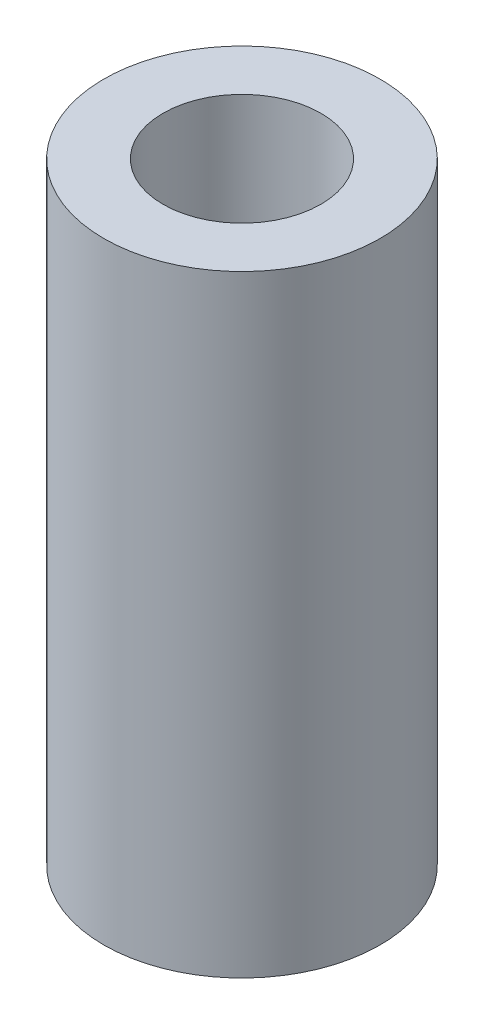
ISO-10303-21;
HEADER;
FILE_DESCRIPTION(('STEP AP214'),'2;1');
FILE_NAME('part.step','',(''),(''),'','','');
FILE_SCHEMA(('AUTOMOTIVE_DESIGN { 1 0 10303 214 1 1 1 1 }'));
ENDSEC;
DATA;
#1=APPLICATION_CONTEXT('core data for automotive mechanical design processes');
#2=APPLICATION_PROTOCOL_DEFINITION('international standard','automotive_design',2000,#1);
#3=PRODUCT_CONTEXT('',#1,'mechanical');
#4=PRODUCT('Part','Part','',(#3));
#5=PRODUCT_RELATED_PRODUCT_CATEGORY('part','',(#4));
#6=PRODUCT_DEFINITION_FORMATION('','',#4);
#7=PRODUCT_DEFINITION_CONTEXT('part definition',#1,'design');
#8=PRODUCT_DEFINITION('design','',#6,#7);
#9=PRODUCT_DEFINITION_SHAPE('','',#8);
#10=(LENGTH_UNIT() NAMED_UNIT(*) SI_UNIT(.MILLI.,.METRE.));
#11=(NAMED_UNIT(*) PLANE_ANGLE_UNIT() SI_UNIT($,.RADIAN.));
#12=(NAMED_UNIT(*) SI_UNIT($,.STERADIAN.) SOLID_ANGLE_UNIT());
#13=UNCERTAINTY_MEASURE_WITH_UNIT(LENGTH_MEASURE(1.E-05),#10,'distance_accuracy_value','');
#14=(GEOMETRIC_REPRESENTATION_CONTEXT(3) GLOBAL_UNCERTAINTY_ASSIGNED_CONTEXT((#13)) GLOBAL_UNIT_ASSIGNED_CONTEXT((#10,
#11,#12)) REPRESENTATION_CONTEXT('',''));
#15=CARTESIAN_POINT('',(0.,0.,0.));
#16=DIRECTION('',(0.,0.,1.));
#17=DIRECTION('',(1.,0.,0.));
#18=AXIS2_PLACEMENT_3D('',#15,#16,#17);
#19=CARTESIAN_POINT('',(0.,49.2252,0.));
#20=DIRECTION('',(0.,1.,0.));
#21=DIRECTION('',(0.,0.,1.));
#22=AXIS2_PLACEMENT_3D('',#19,#20,#21);
#23=CYLINDRICAL_SURFACE('',#22,6.35);
#24=CARTESIAN_POINT('',(0.,49.2252,0.));
#25=DIRECTION('',(0.,1.,0.));
#26=DIRECTION('',(0.,0.,1.));
#27=AXIS2_PLACEMENT_3D('',#24,#25,#26);
#28=CIRCLE('',#27,6.35);
#29=CARTESIAN_POINT('',(0.,49.2252,6.35));
#30=VERTEX_POINT('',#29);
#31=EDGE_CURVE('E18',#30,#30,#28,.F.);
#32=ORIENTED_EDGE('',*,*,#31,.F.);
#33=EDGE_LOOP('',(#32));
#34=FACE_BOUND('',#33,.T.);
#35=CARTESIAN_POINT('',(0.,0.,0.));
#36=DIRECTION('',(0.,1.,0.));
#37=DIRECTION('',(0.,0.,1.));
#38=AXIS2_PLACEMENT_3D('',#35,#36,#37);
#39=CIRCLE('',#38,6.35);
#40=CARTESIAN_POINT('',(0.,0.,6.35));
#41=VERTEX_POINT('',#40);
#42=EDGE_CURVE('E27',#41,#41,#39,.F.);
#43=ORIENTED_EDGE('',*,*,#42,.T.);
#44=EDGE_LOOP('',(#43));
#45=FACE_BOUND('',#44,.T.);
#46=ADVANCED_FACE('F15',(#34,#45),#23,.F.);
#47=CARTESIAN_POINT('',(0.,49.2252,0.));
#48=DIRECTION('',(0.,1.,0.));
#49=DIRECTION('',(0.,0.,1.));
#50=AXIS2_PLACEMENT_3D('',#47,#48,#49);
#51=PLANE('',#50);
#52=ORIENTED_EDGE('',*,*,#31,.T.);
#53=EDGE_LOOP('',(#52));
#54=FACE_BOUND('',#53,.T.);
#55=CARTESIAN_POINT('',(0.,49.2252,0.));
#56=DIRECTION('',(0.,1.,0.));
#57=DIRECTION('',(0.,0.,1.));
#58=AXIS2_PLACEMENT_3D('',#55,#56,#57);
#59=CIRCLE('',#58,11.1125);
#60=CARTESIAN_POINT('',(0.,49.2252,11.1125));
#61=VERTEX_POINT('',#60);
#62=EDGE_CURVE('E22',#61,#61,#59,.F.);
#63=ORIENTED_EDGE('',*,*,#62,.F.);
#64=EDGE_LOOP('',(#63));
#65=FACE_BOUND('',#64,.T.);
#66=ADVANCED_FACE('F35',(#54,#65),#51,.T.);
#67=CARTESIAN_POINT('',(0.,0.,0.));
#68=DIRECTION('',(0.,1.,0.));
#69=DIRECTION('',(0.,0.,1.));
#70=AXIS2_PLACEMENT_3D('',#67,#68,#69);
#71=PLANE('',#70);
#72=ORIENTED_EDGE('',*,*,#42,.F.);
#73=EDGE_LOOP('',(#72));
#74=FACE_BOUND('',#73,.T.);
#75=CARTESIAN_POINT('',(0.,0.,0.));
#76=DIRECTION('',(0.,1.,0.));
#77=DIRECTION('',(0.,0.,1.));
#78=AXIS2_PLACEMENT_3D('',#75,#76,#77);
#79=CIRCLE('',#78,11.1125);
#80=CARTESIAN_POINT('',(0.,0.,11.1125));
#81=VERTEX_POINT('',#80);
#82=EDGE_CURVE('E10',#81,#81,#79,.T.);
#83=ORIENTED_EDGE('',*,*,#82,.F.);
#84=EDGE_LOOP('',(#83));
#85=FACE_BOUND('',#84,.T.);
#86=ADVANCED_FACE('F43',(#74,#85),#71,.F.);
#87=CARTESIAN_POINT('',(0.,0.,0.));
#88=DIRECTION('',(0.,1.,0.));
#89=DIRECTION('',(0.,0.,1.));
#90=AXIS2_PLACEMENT_3D('',#87,#88,#89);
#91=CYLINDRICAL_SURFACE('',#90,11.1125);
#92=ORIENTED_EDGE('',*,*,#62,.T.);
#93=EDGE_LOOP('',(#92));
#94=FACE_BOUND('',#93,.T.);
#95=ORIENTED_EDGE('',*,*,#82,.T.);
#96=EDGE_LOOP('',(#95));
#97=FACE_BOUND('',#96,.T.);
#98=ADVANCED_FACE('F44',(#94,#97),#91,.T.);
#99=CLOSED_SHELL('',(#46,#66,#86,#98));
#100=MANIFOLD_SOLID_BREP('B1',#99);
#101=ADVANCED_BREP_SHAPE_REPRESENTATION('',(#18,#100),#14);
#102=SHAPE_DEFINITION_REPRESENTATION(#9,#101);
ENDSEC;
END-ISO-10303-21;
